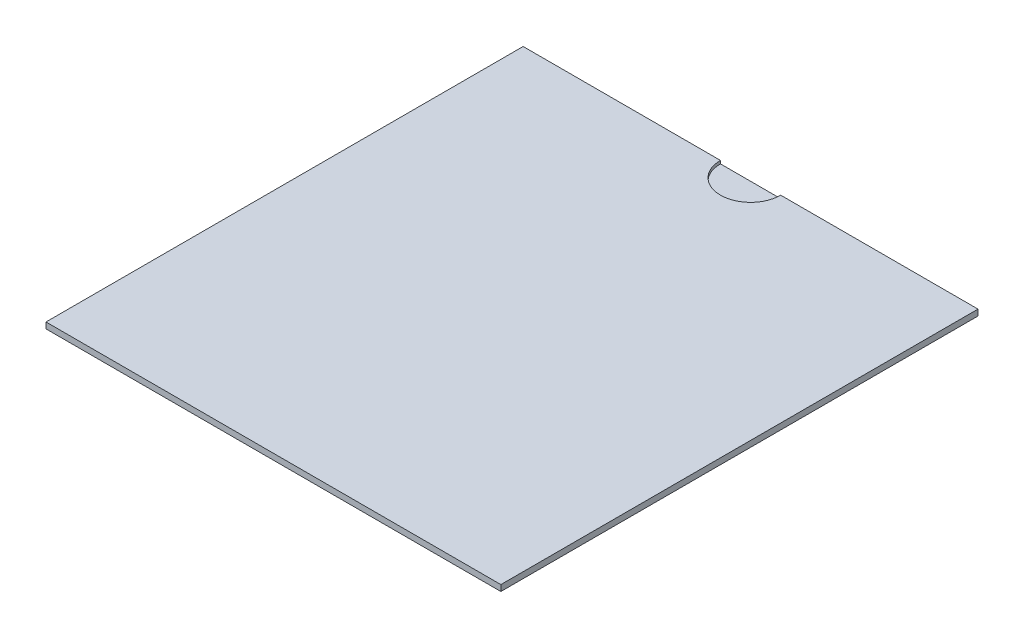
ISO-10303-21;
HEADER;
FILE_DESCRIPTION(('STEP AP214'),'2;1');
FILE_NAME('part.step','',(''),(''),'','','');
FILE_SCHEMA(('AUTOMOTIVE_DESIGN { 1 0 10303 214 1 1 1 1 }'));
ENDSEC;
DATA;
#1=APPLICATION_CONTEXT('core data for automotive mechanical design processes');
#2=APPLICATION_PROTOCOL_DEFINITION('international standard','automotive_design',2000,#1);
#3=PRODUCT_CONTEXT('',#1,'mechanical');
#4=PRODUCT('Part','Part','',(#3));
#5=PRODUCT_RELATED_PRODUCT_CATEGORY('part','',(#4));
#6=PRODUCT_DEFINITION_FORMATION('','',#4);
#7=PRODUCT_DEFINITION_CONTEXT('part definition',#1,'design');
#8=PRODUCT_DEFINITION('design','',#6,#7);
#9=PRODUCT_DEFINITION_SHAPE('','',#8);
#10=(LENGTH_UNIT() NAMED_UNIT(*) SI_UNIT(.MILLI.,.METRE.));
#11=(NAMED_UNIT(*) PLANE_ANGLE_UNIT() SI_UNIT($,.RADIAN.));
#12=(NAMED_UNIT(*) SI_UNIT($,.STERADIAN.) SOLID_ANGLE_UNIT());
#13=UNCERTAINTY_MEASURE_WITH_UNIT(LENGTH_MEASURE(1.E-05),#10,'distance_accuracy_value','');
#14=(GEOMETRIC_REPRESENTATION_CONTEXT(3) GLOBAL_UNCERTAINTY_ASSIGNED_CONTEXT((#13)) GLOBAL_UNIT_ASSIGNED_CONTEXT((#10,
#11,#12)) REPRESENTATION_CONTEXT('',''));
#15=CARTESIAN_POINT('',(0.,0.,0.));
#16=DIRECTION('',(0.,0.,1.));
#17=DIRECTION('',(1.,0.,0.));
#18=AXIS2_PLACEMENT_3D('',#15,#16,#17);
#19=CARTESIAN_POINT('',(1289.685,0.,-352.71075));
#20=DIRECTION('',(1.,0.,0.));
#21=DIRECTION('',(0.,0.,-1.));
#22=AXIS2_PLACEMENT_3D('',#19,#20,#21);
#23=PLANE('',#22);
#24=DIRECTION('',(0.,0.,-1.));
#25=VECTOR('',#24,1.);
#26=CARTESIAN_POINT('',(1289.685,2.54,-352.71075));
#27=LINE('',#26,#25);
#28=CARTESIAN_POINT('',(1289.685,2.54,-151.54275));
#29=VERTEX_POINT('',#28);
#30=CARTESIAN_POINT('',(1289.685,2.54,-352.71075));
#31=VERTEX_POINT('',#30);
#32=EDGE_CURVE('E110',#29,#31,#27,.T.);
#33=ORIENTED_EDGE('',*,*,#32,.F.);
#34=DIRECTION('',(0.,1.,0.));
#35=VECTOR('',#34,1.);
#36=CARTESIAN_POINT('',(1289.685,0.,-151.54275));
#37=LINE('',#36,#35);
#38=CARTESIAN_POINT('',(1289.685,0.,-151.54275));
#39=VERTEX_POINT('',#38);
#40=EDGE_CURVE('E11',#39,#29,#37,.T.);
#41=ORIENTED_EDGE('',*,*,#40,.F.);
#42=DIRECTION('',(0.,0.,-1.));
#43=VECTOR('',#42,1.);
#44=CARTESIAN_POINT('',(1289.685,0.,-352.71075));
#45=LINE('',#44,#43);
#46=CARTESIAN_POINT('',(1289.685,0.,-352.71075));
#47=VERTEX_POINT('',#46);
#48=EDGE_CURVE('E112',#39,#47,#45,.T.);
#49=ORIENTED_EDGE('',*,*,#48,.T.);
#50=DIRECTION('',(0.,1.,0.));
#51=VECTOR('',#50,1.);
#52=CARTESIAN_POINT('',(1289.685,0.,-352.71075));
#53=LINE('',#52,#51);
#54=EDGE_CURVE('E37',#47,#31,#53,.T.);
#55=ORIENTED_EDGE('',*,*,#54,.T.);
#56=EDGE_LOOP('',(#33,#41,#49,#55));
#57=FACE_BOUND('',#56,.T.);
#58=ADVANCED_FACE('F34',(#57),#23,.T.);
#59=CARTESIAN_POINT('',(1097.915,0.,-151.54275));
#60=DIRECTION('',(0.,0.,1.));
#61=DIRECTION('',(1.,0.,0.));
#62=AXIS2_PLACEMENT_3D('',#59,#60,#61);
#63=PLANE('',#62);
#64=DIRECTION('',(1.,0.,0.));
#65=VECTOR('',#64,1.);
#66=CARTESIAN_POINT('',(1097.915,2.54,-151.54275));
#67=LINE('',#66,#65);
#68=CARTESIAN_POINT('',(1097.915,2.54,-151.54275));
#69=VERTEX_POINT('',#68);
#70=EDGE_CURVE('E115',#69,#29,#67,.T.);
#71=ORIENTED_EDGE('',*,*,#70,.F.);
#72=DIRECTION('',(0.,1.,0.));
#73=VECTOR('',#72,1.);
#74=CARTESIAN_POINT('',(1097.915,0.,-151.54275));
#75=LINE('',#74,#73);
#76=CARTESIAN_POINT('',(1097.915,0.,-151.54275));
#77=VERTEX_POINT('',#76);
#78=EDGE_CURVE('E42',#77,#69,#75,.T.);
#79=ORIENTED_EDGE('',*,*,#78,.F.);
#80=DIRECTION('',(1.,0.,0.));
#81=VECTOR('',#80,1.);
#82=CARTESIAN_POINT('',(1097.915,0.,-151.54275));
#83=LINE('',#82,#81);
#84=EDGE_CURVE('E120',#77,#39,#83,.T.);
#85=ORIENTED_EDGE('',*,*,#84,.T.);
#86=ORIENTED_EDGE('',*,*,#40,.T.);
#87=EDGE_LOOP('',(#71,#79,#85,#86));
#88=FACE_BOUND('',#87,.T.);
#89=ADVANCED_FACE('F137',(#88),#63,.T.);
#90=CARTESIAN_POINT('',(1097.915,0.,-352.71075));
#91=DIRECTION('',(-1.,0.,0.));
#92=DIRECTION('',(0.,0.,1.));
#93=AXIS2_PLACEMENT_3D('',#90,#91,#92);
#94=PLANE('',#93);
#95=DIRECTION('',(0.,0.,1.));
#96=VECTOR('',#95,1.);
#97=CARTESIAN_POINT('',(1097.915,2.54,-352.71075));
#98=LINE('',#97,#96);
#99=CARTESIAN_POINT('',(1097.915,2.54,-352.71075));
#100=VERTEX_POINT('',#99);
#101=EDGE_CURVE('E127',#100,#69,#98,.T.);
#102=ORIENTED_EDGE('',*,*,#101,.F.);
#103=DIRECTION('',(0.,1.,0.));
#104=VECTOR('',#103,1.);
#105=CARTESIAN_POINT('',(1097.915,0.,-352.71075));
#106=LINE('',#105,#104);
#107=CARTESIAN_POINT('',(1097.915,0.,-352.71075));
#108=VERTEX_POINT('',#107);
#109=EDGE_CURVE('E132',#108,#100,#106,.T.);
#110=ORIENTED_EDGE('',*,*,#109,.F.);
#111=DIRECTION('',(0.,0.,1.));
#112=VECTOR('',#111,1.);
#113=CARTESIAN_POINT('',(1097.915,0.,-352.71075));
#114=LINE('',#113,#112);
#115=EDGE_CURVE('E117',#108,#77,#114,.T.);
#116=ORIENTED_EDGE('',*,*,#115,.T.);
#117=ORIENTED_EDGE('',*,*,#78,.T.);
#118=EDGE_LOOP('',(#102,#110,#116,#117));
#119=FACE_BOUND('',#118,.T.);
#120=ADVANCED_FACE('F141',(#119),#94,.T.);
#121=CARTESIAN_POINT('',(1097.915,0.,-352.71075));
#122=DIRECTION('',(0.,0.,-1.));
#123=DIRECTION('',(-1.,0.,0.));
#124=AXIS2_PLACEMENT_3D('',#121,#122,#123);
#125=PLANE('',#124);
#126=DIRECTION('',(0.,1.,0.));
#127=VECTOR('',#126,1.);
#128=CARTESIAN_POINT('',(1181.1,1.27,-352.71075));
#129=LINE('',#128,#127);
#130=CARTESIAN_POINT('',(1181.1,1.27,-352.71075));
#131=VERTEX_POINT('',#130);
#132=CARTESIAN_POINT('',(1181.1,2.54,-352.71075));
#133=VERTEX_POINT('',#132);
#134=EDGE_CURVE('E50',#131,#133,#129,.T.);
#135=ORIENTED_EDGE('',*,*,#134,.F.);
#136=DIRECTION('',(-1.,0.,0.));
#137=VECTOR('',#136,1.);
#138=CARTESIAN_POINT('',(1206.5,1.27,-352.71075));
#139=LINE('',#138,#137);
#140=CARTESIAN_POINT('',(1206.5,1.27,-352.71075));
#141=VERTEX_POINT('',#140);
#142=EDGE_CURVE('E100',#141,#131,#139,.T.);
#143=ORIENTED_EDGE('',*,*,#142,.F.);
#144=DIRECTION('',(0.,1.,0.));
#145=VECTOR('',#144,1.);
#146=CARTESIAN_POINT('',(1206.5,1.27,-352.71075));
#147=LINE('',#146,#145);
#148=CARTESIAN_POINT('',(1206.5,2.54,-352.71075));
#149=VERTEX_POINT('',#148);
#150=EDGE_CURVE('E92',#141,#149,#147,.T.);
#151=ORIENTED_EDGE('',*,*,#150,.T.);
#152=DIRECTION('',(-1.,0.,0.));
#153=VECTOR('',#152,1.);
#154=CARTESIAN_POINT('',(1097.915,2.54,-352.71075));
#155=LINE('',#154,#153);
#156=EDGE_CURVE('E125',#31,#149,#155,.T.);
#157=ORIENTED_EDGE('',*,*,#156,.F.);
#158=ORIENTED_EDGE('',*,*,#54,.F.);
#159=DIRECTION('',(-1.,0.,0.));
#160=VECTOR('',#159,1.);
#161=CARTESIAN_POINT('',(1097.915,0.,-352.71075));
#162=LINE('',#161,#160);
#163=EDGE_CURVE('E114',#47,#108,#162,.T.);
#164=ORIENTED_EDGE('',*,*,#163,.T.);
#165=ORIENTED_EDGE('',*,*,#109,.T.);
#166=EDGE_CURVE('E124',#133,#100,#155,.T.);
#167=ORIENTED_EDGE('',*,*,#166,.F.);
#168=EDGE_LOOP('',(#135,#143,#151,#157,#158,#164,#165,#167));
#169=FACE_BOUND('',#168,.T.);
#170=ADVANCED_FACE('F105',(#169),#125,.T.);
#171=CARTESIAN_POINT('',(0.,0.,0.));
#172=DIRECTION('',(0.,1.,0.));
#173=DIRECTION('',(0.,0.,1.));
#174=AXIS2_PLACEMENT_3D('',#171,#172,#173);
#175=PLANE('',#174);
#176=ORIENTED_EDGE('',*,*,#48,.F.);
#177=ORIENTED_EDGE('',*,*,#84,.F.);
#178=ORIENTED_EDGE('',*,*,#115,.F.);
#179=ORIENTED_EDGE('',*,*,#163,.F.);
#180=EDGE_LOOP('',(#176,#177,#178,#179));
#181=FACE_BOUND('',#180,.T.);
#182=ADVANCED_FACE('F143',(#181),#175,.F.);
#183=CARTESIAN_POINT('',(0.,2.54,0.));
#184=DIRECTION('',(0.,1.,0.));
#185=DIRECTION('',(0.,0.,1.));
#186=AXIS2_PLACEMENT_3D('',#183,#184,#185);
#187=PLANE('',#186);
#188=CARTESIAN_POINT('',(1193.8,2.54,-352.71075));
#189=DIRECTION('',(0.,1.,0.));
#190=DIRECTION('',(0.,0.,1.));
#191=AXIS2_PLACEMENT_3D('',#188,#189,#190);
#192=CIRCLE('',#191,12.6999999999999);
#193=EDGE_CURVE('E97',#133,#149,#192,.T.);
#194=ORIENTED_EDGE('',*,*,#193,.F.);
#195=ORIENTED_EDGE('',*,*,#166,.T.);
#196=ORIENTED_EDGE('',*,*,#101,.T.);
#197=ORIENTED_EDGE('',*,*,#70,.T.);
#198=ORIENTED_EDGE('',*,*,#32,.T.);
#199=ORIENTED_EDGE('',*,*,#156,.T.);
#200=EDGE_LOOP('',(#194,#195,#196,#197,#198,#199));
#201=FACE_BOUND('',#200,.T.);
#202=ADVANCED_FACE('F136',(#201),#187,.T.);
#203=CARTESIAN_POINT('',(1193.8,1.27,-352.71075));
#204=DIRECTION('',(0.,1.,0.));
#205=DIRECTION('',(0.,0.,1.));
#206=AXIS2_PLACEMENT_3D('',#203,#204,#205);
#207=CYLINDRICAL_SURFACE('',#206,12.6999999999999);
#208=ORIENTED_EDGE('',*,*,#193,.T.);
#209=ORIENTED_EDGE('',*,*,#150,.F.);
#210=CARTESIAN_POINT('',(1193.8,1.27,-352.71075));
#211=DIRECTION('',(0.,1.,0.));
#212=DIRECTION('',(0.,0.,1.));
#213=AXIS2_PLACEMENT_3D('',#210,#211,#212);
#214=CIRCLE('',#213,12.6999999999999);
#215=EDGE_CURVE('E95',#131,#141,#214,.T.);
#216=ORIENTED_EDGE('',*,*,#215,.F.);
#217=ORIENTED_EDGE('',*,*,#134,.T.);
#218=EDGE_LOOP('',(#208,#209,#216,#217));
#219=FACE_BOUND('',#218,.T.);
#220=ADVANCED_FACE('F94',(#219),#207,.F.);
#221=CARTESIAN_POINT('',(1193.8,1.27,-352.71075));
#222=DIRECTION('',(0.,1.,0.));
#223=DIRECTION('',(0.,0.,1.));
#224=AXIS2_PLACEMENT_3D('',#221,#222,#223);
#225=PLANE('',#224);
#226=ORIENTED_EDGE('',*,*,#215,.T.);
#227=ORIENTED_EDGE('',*,*,#142,.T.);
#228=EDGE_LOOP('',(#226,#227));
#229=FACE_BOUND('',#228,.T.);
#230=ADVANCED_FACE('F103',(#229),#225,.T.);
#231=CLOSED_SHELL('',(#58,#89,#120,#170,#182,#202,#220,#230));
#232=MANIFOLD_SOLID_BREP('B2',#231);
#233=ADVANCED_BREP_SHAPE_REPRESENTATION('',(#18,#232),#14);
#234=SHAPE_DEFINITION_REPRESENTATION(#9,#233);
ENDSEC;
END-ISO-10303-21;
